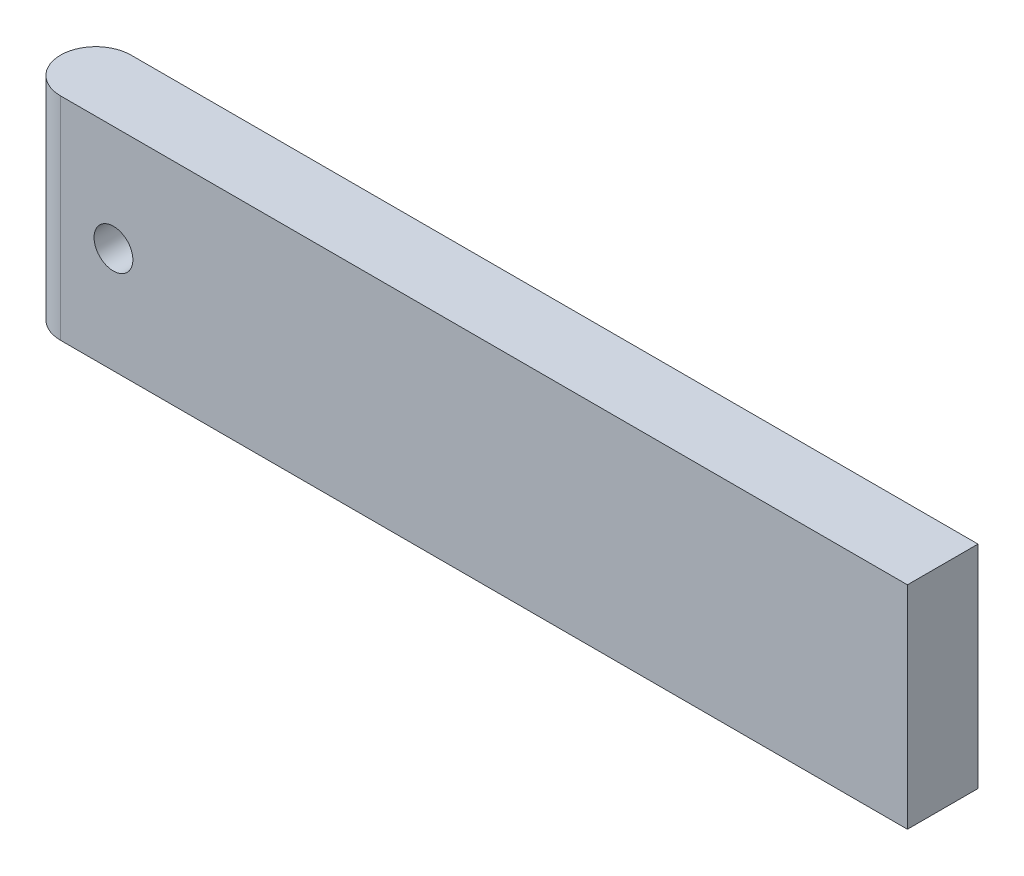
ISO-10303-21;
HEADER;
FILE_DESCRIPTION(('STEP AP214'),'2;1');
FILE_NAME('part.step','',(''),(''),'','','');
FILE_SCHEMA(('AUTOMOTIVE_DESIGN { 1 0 10303 214 1 1 1 1 }'));
ENDSEC;
DATA;
#1=APPLICATION_CONTEXT('core data for automotive mechanical design processes');
#2=APPLICATION_PROTOCOL_DEFINITION('international standard','automotive_design',2000,#1);
#3=PRODUCT_CONTEXT('',#1,'mechanical');
#4=PRODUCT('Part','Part','',(#3));
#5=PRODUCT_RELATED_PRODUCT_CATEGORY('part','',(#4));
#6=PRODUCT_DEFINITION_FORMATION('','',#4);
#7=PRODUCT_DEFINITION_CONTEXT('part definition',#1,'design');
#8=PRODUCT_DEFINITION('design','',#6,#7);
#9=PRODUCT_DEFINITION_SHAPE('','',#8);
#10=(LENGTH_UNIT() NAMED_UNIT(*) SI_UNIT(.MILLI.,.METRE.));
#11=(NAMED_UNIT(*) PLANE_ANGLE_UNIT() SI_UNIT($,.RADIAN.));
#12=(NAMED_UNIT(*) SI_UNIT($,.STERADIAN.) SOLID_ANGLE_UNIT());
#13=UNCERTAINTY_MEASURE_WITH_UNIT(LENGTH_MEASURE(1.E-05),#10,'distance_accuracy_value','');
#14=(GEOMETRIC_REPRESENTATION_CONTEXT(3) GLOBAL_UNCERTAINTY_ASSIGNED_CONTEXT((#13)) GLOBAL_UNIT_ASSIGNED_CONTEXT((#10,
#11,#12)) REPRESENTATION_CONTEXT('',''));
#15=CARTESIAN_POINT('',(0.,0.,0.));
#16=DIRECTION('',(0.,0.,1.));
#17=DIRECTION('',(1.,0.,0.));
#18=AXIS2_PLACEMENT_3D('',#15,#16,#17);
#19=CARTESIAN_POINT('',(0.,0.,4.));
#20=DIRECTION('',(0.,0.,1.));
#21=DIRECTION('',(1.,0.,0.));
#22=AXIS2_PLACEMENT_3D('',#19,#20,#21);
#23=PLANE('',#22);
#24=DIRECTION('',(-1.,0.,0.));
#25=VECTOR('',#24,1.);
#26=CARTESIAN_POINT('',(5.,6.,4.));
#27=LINE('',#26,#25);
#28=CARTESIAN_POINT('',(45.,6.00000000000001,4.));
#29=VERTEX_POINT('',#28);
#30=CARTESIAN_POINT('',(-3.,6.,4.));
#31=VERTEX_POINT('',#30);
#32=EDGE_CURVE('E116',#29,#31,#27,.T.);
#33=ORIENTED_EDGE('',*,*,#32,.T.);
#34=DIRECTION('',(0.,-1.,0.));
#35=VECTOR('',#34,1.);
#36=CARTESIAN_POINT('',(-3.,-6.,4.));
#37=LINE('',#36,#35);
#38=CARTESIAN_POINT('',(-3.,-6.,4.));
#39=VERTEX_POINT('',#38);
#40=EDGE_CURVE('E118',#31,#39,#37,.T.);
#41=ORIENTED_EDGE('',*,*,#40,.T.);
#42=DIRECTION('',(1.,0.,0.));
#43=VECTOR('',#42,1.);
#44=CARTESIAN_POINT('',(5.,-6.,4.));
#45=LINE('',#44,#43);
#46=CARTESIAN_POINT('',(45.,-5.99999999999999,4.));
#47=VERTEX_POINT('',#46);
#48=EDGE_CURVE('E114',#39,#47,#45,.T.);
#49=ORIENTED_EDGE('',*,*,#48,.T.);
#50=DIRECTION('',(0.,-1.,0.));
#51=VECTOR('',#50,1.);
#52=CARTESIAN_POINT('',(45.,6.00000000000001,4.));
#53=LINE('',#52,#51);
#54=EDGE_CURVE('E104',#29,#47,#53,.T.);
#55=ORIENTED_EDGE('',*,*,#54,.F.);
#56=EDGE_LOOP('',(#33,#41,#49,#55));
#57=FACE_BOUND('',#56,.T.);
#58=CARTESIAN_POINT('',(0.,0.,4.));
#59=DIRECTION('',(0.,0.,1.));
#60=DIRECTION('',(1.,0.,0.));
#61=AXIS2_PLACEMENT_3D('',#58,#59,#60);
#62=CIRCLE('',#61,1.1);
#63=CARTESIAN_POINT('',(1.1,0.,4.));
#64=VERTEX_POINT('',#63);
#65=EDGE_CURVE('E90',#64,#64,#62,.T.);
#66=ORIENTED_EDGE('',*,*,#65,.F.);
#67=EDGE_LOOP('',(#66));
#68=FACE_BOUND('',#67,.T.);
#69=ADVANCED_FACE('F35',(#57,#68),#23,.T.);
#70=CARTESIAN_POINT('',(0.,0.,0.));
#71=DIRECTION('',(0.,0.,1.));
#72=DIRECTION('',(1.,0.,0.));
#73=AXIS2_PLACEMENT_3D('',#70,#71,#72);
#74=PLANE('',#73);
#75=DIRECTION('',(1.,0.,0.));
#76=VECTOR('',#75,1.);
#77=CARTESIAN_POINT('',(5.,-6.,0.));
#78=LINE('',#77,#76);
#79=CARTESIAN_POINT('',(-3.,-6.,0.));
#80=VERTEX_POINT('',#79);
#81=CARTESIAN_POINT('',(45.,-5.99999999999999,0.));
#82=VERTEX_POINT('',#81);
#83=EDGE_CURVE('E81',#80,#82,#78,.T.);
#84=ORIENTED_EDGE('',*,*,#83,.F.);
#85=DIRECTION('',(0.,-1.,0.));
#86=VECTOR('',#85,1.);
#87=CARTESIAN_POINT('',(-3.,0.,0.));
#88=LINE('',#87,#86);
#89=CARTESIAN_POINT('',(-3.,6.,0.));
#90=VERTEX_POINT('',#89);
#91=EDGE_CURVE('E11',#80,#90,#88,.F.);
#92=ORIENTED_EDGE('',*,*,#91,.T.);
#93=DIRECTION('',(-1.,0.,0.));
#94=VECTOR('',#93,1.);
#95=CARTESIAN_POINT('',(5.,6.,0.));
#96=LINE('',#95,#94);
#97=CARTESIAN_POINT('',(45.,6.00000000000001,0.));
#98=VERTEX_POINT('',#97);
#99=EDGE_CURVE('E89',#98,#90,#96,.T.);
#100=ORIENTED_EDGE('',*,*,#99,.F.);
#101=DIRECTION('',(0.,1.,0.));
#102=VECTOR('',#101,1.);
#103=CARTESIAN_POINT('',(45.,-5.99999999999999,0.));
#104=LINE('',#103,#102);
#105=EDGE_CURVE('E93',#82,#98,#104,.T.);
#106=ORIENTED_EDGE('',*,*,#105,.F.);
#107=EDGE_LOOP('',(#84,#92,#100,#106));
#108=FACE_BOUND('',#107,.T.);
#109=CARTESIAN_POINT('',(0.,0.,0.));
#110=DIRECTION('',(0.,0.,1.));
#111=DIRECTION('',(1.,0.,0.));
#112=AXIS2_PLACEMENT_3D('',#109,#110,#111);
#113=CIRCLE('',#112,1.1);
#114=CARTESIAN_POINT('',(1.1,0.,0.));
#115=VERTEX_POINT('',#114);
#116=EDGE_CURVE('E111',#115,#115,#113,.T.);
#117=ORIENTED_EDGE('',*,*,#116,.T.);
#118=EDGE_LOOP('',(#117));
#119=FACE_BOUND('',#118,.T.);
#120=ADVANCED_FACE('F94',(#108,#119),#74,.F.);
#121=CARTESIAN_POINT('',(5.,-6.,4.));
#122=DIRECTION('',(0.,1.,0.));
#123=DIRECTION('',(-1.,0.,0.));
#124=AXIS2_PLACEMENT_3D('',#121,#122,#123);
#125=PLANE('',#124);
#126=ORIENTED_EDGE('',*,*,#48,.F.);
#127=CARTESIAN_POINT('',(-3.,-6.,2.));
#128=DIRECTION('',(0.,1.,0.));
#129=DIRECTION('',(-1.,0.,0.));
#130=AXIS2_PLACEMENT_3D('',#127,#128,#129);
#131=CIRCLE('',#130,2.);
#132=CARTESIAN_POINT('',(-5.,-6.,2.));
#133=VERTEX_POINT('',#132);
#134=EDGE_CURVE('E124',#39,#133,#131,.F.);
#135=ORIENTED_EDGE('',*,*,#134,.T.);
#136=CARTESIAN_POINT('',(-3.,-6.,2.));
#137=DIRECTION('',(0.,1.,0.));
#138=DIRECTION('',(-1.,0.,0.));
#139=AXIS2_PLACEMENT_3D('',#136,#137,#138);
#140=CIRCLE('',#139,2.);
#141=EDGE_CURVE('E88',#133,#80,#140,.F.);
#142=ORIENTED_EDGE('',*,*,#141,.T.);
#143=ORIENTED_EDGE('',*,*,#83,.T.);
#144=DIRECTION('',(0.,0.,-1.));
#145=VECTOR('',#144,1.);
#146=CARTESIAN_POINT('',(45.,-5.99999999999999,4.));
#147=LINE('',#146,#145);
#148=EDGE_CURVE('E86',#47,#82,#147,.T.);
#149=ORIENTED_EDGE('',*,*,#148,.F.);
#150=EDGE_LOOP('',(#126,#135,#142,#143,#149));
#151=FACE_BOUND('',#150,.T.);
#152=ADVANCED_FACE('F84',(#151),#125,.F.);
#153=CARTESIAN_POINT('',(5.,6.,4.));
#154=DIRECTION('',(0.,-1.,0.));
#155=DIRECTION('',(1.,0.,0.));
#156=AXIS2_PLACEMENT_3D('',#153,#154,#155);
#157=PLANE('',#156);
#158=CARTESIAN_POINT('',(-3.,6.,2.));
#159=DIRECTION('',(0.,-1.,0.));
#160=DIRECTION('',(1.,0.,0.));
#161=AXIS2_PLACEMENT_3D('',#158,#159,#160);
#162=CIRCLE('',#161,2.);
#163=CARTESIAN_POINT('',(-5.,6.,2.));
#164=VERTEX_POINT('',#163);
#165=EDGE_CURVE('E51',#90,#164,#162,.F.);
#166=ORIENTED_EDGE('',*,*,#165,.T.);
#167=CARTESIAN_POINT('',(-3.,6.,2.));
#168=DIRECTION('',(0.,-1.,0.));
#169=DIRECTION('',(1.,0.,0.));
#170=AXIS2_PLACEMENT_3D('',#167,#168,#169);
#171=CIRCLE('',#170,2.);
#172=EDGE_CURVE('E44',#164,#31,#171,.F.);
#173=ORIENTED_EDGE('',*,*,#172,.T.);
#174=ORIENTED_EDGE('',*,*,#32,.F.);
#175=DIRECTION('',(0.,0.,1.));
#176=VECTOR('',#175,1.);
#177=CARTESIAN_POINT('',(45.,6.00000000000001,0.));
#178=LINE('',#177,#176);
#179=EDGE_CURVE('E99',#98,#29,#178,.T.);
#180=ORIENTED_EDGE('',*,*,#179,.F.);
#181=ORIENTED_EDGE('',*,*,#99,.T.);
#182=EDGE_LOOP('',(#166,#173,#174,#180,#181));
#183=FACE_BOUND('',#182,.T.);
#184=ADVANCED_FACE('F128',(#183),#157,.F.);
#185=CARTESIAN_POINT('',(0.,0.,4.));
#186=DIRECTION('',(0.,0.,-1.));
#187=DIRECTION('',(-1.,0.,0.));
#188=AXIS2_PLACEMENT_3D('',#185,#186,#187);
#189=CYLINDRICAL_SURFACE('',#188,1.1);
#190=ORIENTED_EDGE('',*,*,#65,.T.);
#191=EDGE_LOOP('',(#190));
#192=FACE_BOUND('',#191,.T.);
#193=ORIENTED_EDGE('',*,*,#116,.F.);
#194=EDGE_LOOP('',(#193));
#195=FACE_BOUND('',#194,.T.);
#196=ADVANCED_FACE('F137',(#192,#195),#189,.F.);
#197=CARTESIAN_POINT('',(-3.,-6.,2.));
#198=DIRECTION('',(0.,-1.,0.));
#199=DIRECTION('',(1.,0.,0.));
#200=AXIS2_PLACEMENT_3D('',#197,#198,#199);
#201=CYLINDRICAL_SURFACE('',#200,2.);
#202=DIRECTION('',(0.,-1.,0.));
#203=VECTOR('',#202,1.);
#204=CARTESIAN_POINT('',(-5.,-6.,2.));
#205=LINE('',#204,#203);
#206=EDGE_CURVE('E39',#164,#133,#205,.T.);
#207=ORIENTED_EDGE('',*,*,#206,.F.);
#208=ORIENTED_EDGE('',*,*,#165,.F.);
#209=ORIENTED_EDGE('',*,*,#91,.F.);
#210=ORIENTED_EDGE('',*,*,#141,.F.);
#211=EDGE_LOOP('',(#207,#208,#209,#210));
#212=FACE_BOUND('',#211,.T.);
#213=ADVANCED_FACE('F37',(#212),#201,.T.);
#214=CARTESIAN_POINT('',(-3.,0.,2.));
#215=DIRECTION('',(0.,1.,0.));
#216=DIRECTION('',(-1.,0.,0.));
#217=AXIS2_PLACEMENT_3D('',#214,#215,#216);
#218=CYLINDRICAL_SURFACE('',#217,2.);
#219=ORIENTED_EDGE('',*,*,#172,.F.);
#220=ORIENTED_EDGE('',*,*,#206,.T.);
#221=ORIENTED_EDGE('',*,*,#134,.F.);
#222=ORIENTED_EDGE('',*,*,#40,.F.);
#223=EDGE_LOOP('',(#219,#220,#221,#222));
#224=FACE_BOUND('',#223,.T.);
#225=ADVANCED_FACE('F134',(#224),#218,.T.);
#226=CARTESIAN_POINT('',(45.,0.,0.));
#227=DIRECTION('',(1.,0.,0.));
#228=DIRECTION('',(0.,1.,0.));
#229=AXIS2_PLACEMENT_3D('',#226,#227,#228);
#230=PLANE('',#229);
#231=ORIENTED_EDGE('',*,*,#148,.T.);
#232=ORIENTED_EDGE('',*,*,#105,.T.);
#233=ORIENTED_EDGE('',*,*,#179,.T.);
#234=ORIENTED_EDGE('',*,*,#54,.T.);
#235=EDGE_LOOP('',(#231,#232,#233,#234));
#236=FACE_BOUND('',#235,.T.);
#237=ADVANCED_FACE('F102',(#236),#230,.T.);
#238=CLOSED_SHELL('',(#69,#120,#152,#184,#196,#213,#225,#237));
#239=MANIFOLD_SOLID_BREP('B2',#238);
#240=ADVANCED_BREP_SHAPE_REPRESENTATION('',(#18,#239),#14);
#241=SHAPE_DEFINITION_REPRESENTATION(#9,#240);
ENDSEC;
END-ISO-10303-21;
